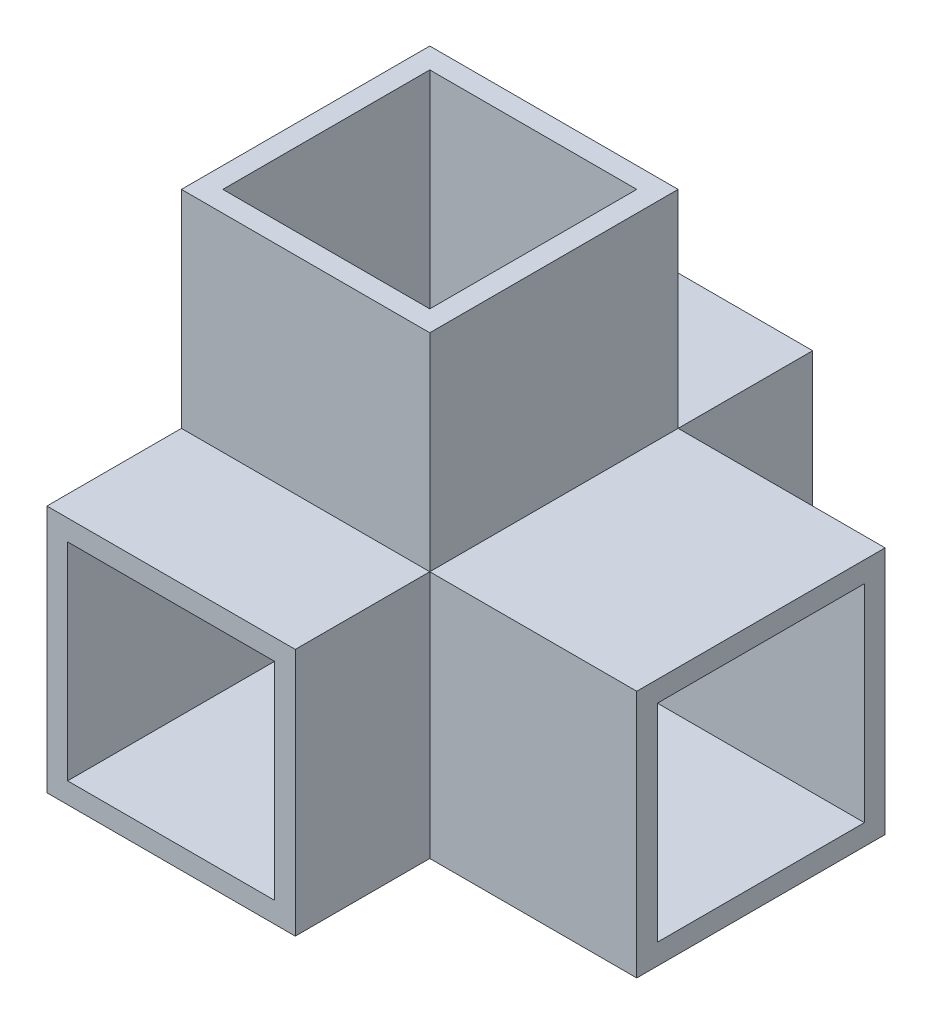
ISO-10303-21;
HEADER;
FILE_DESCRIPTION(('STEP AP214'),'2;1');
FILE_NAME('part.step','',(''),(''),'','','');
FILE_SCHEMA(('AUTOMOTIVE_DESIGN { 1 0 10303 214 1 1 1 1 }'));
ENDSEC;
DATA;
#1=APPLICATION_CONTEXT('core data for automotive mechanical design processes');
#2=APPLICATION_PROTOCOL_DEFINITION('international standard','automotive_design',2000,#1);
#3=PRODUCT_CONTEXT('',#1,'mechanical');
#4=PRODUCT('Part','Part','',(#3));
#5=PRODUCT_RELATED_PRODUCT_CATEGORY('part','',(#4));
#6=PRODUCT_DEFINITION_FORMATION('','',#4);
#7=PRODUCT_DEFINITION_CONTEXT('part definition',#1,'design');
#8=PRODUCT_DEFINITION('design','',#6,#7);
#9=PRODUCT_DEFINITION_SHAPE('','',#8);
#10=(LENGTH_UNIT() NAMED_UNIT(*) SI_UNIT(.MILLI.,.METRE.));
#11=(NAMED_UNIT(*) PLANE_ANGLE_UNIT() SI_UNIT($,.RADIAN.));
#12=(NAMED_UNIT(*) SI_UNIT($,.STERADIAN.) SOLID_ANGLE_UNIT());
#13=UNCERTAINTY_MEASURE_WITH_UNIT(LENGTH_MEASURE(1.E-05),#10,'distance_accuracy_value','');
#14=(GEOMETRIC_REPRESENTATION_CONTEXT(3) GLOBAL_UNCERTAINTY_ASSIGNED_CONTEXT((#13)) GLOBAL_UNIT_ASSIGNED_CONTEXT((#10,
#11,#12)) REPRESENTATION_CONTEXT('',''));
#15=CARTESIAN_POINT('',(0.,0.,0.));
#16=DIRECTION('',(0.,0.,1.));
#17=DIRECTION('',(1.,0.,0.));
#18=AXIS2_PLACEMENT_3D('',#15,#16,#17);
#19=CARTESIAN_POINT('',(-24.,24.,100.));
#20=DIRECTION('',(0.,-1.,0.));
#21=DIRECTION('',(1.,0.,0.));
#22=AXIS2_PLACEMENT_3D('',#19,#20,#21);
#23=PLANE('',#22);
#24=DIRECTION('',(1.,0.,0.));
#25=VECTOR('',#24,1.);
#26=CARTESIAN_POINT('',(24.,24.,74.));
#27=LINE('',#26,#25);
#28=CARTESIAN_POINT('',(-24.,24.,74.));
#29=VERTEX_POINT('',#28);
#30=CARTESIAN_POINT('',(24.,24.,74.));
#31=VERTEX_POINT('',#30);
#32=EDGE_CURVE('E60',#29,#31,#27,.T.);
#33=ORIENTED_EDGE('',*,*,#32,.F.);
#34=DIRECTION('',(0.,0.,-1.));
#35=VECTOR('',#34,1.);
#36=CARTESIAN_POINT('',(-24.,24.,100.));
#37=LINE('',#36,#35);
#38=CARTESIAN_POINT('',(-24.,24.,100.));
#39=VERTEX_POINT('',#38);
#40=EDGE_CURVE('E372',#39,#29,#37,.T.);
#41=ORIENTED_EDGE('',*,*,#40,.F.);
#42=DIRECTION('',(-1.,0.,0.));
#43=VECTOR('',#42,1.);
#44=CARTESIAN_POINT('',(-24.,24.,100.));
#45=LINE('',#44,#43);
#46=CARTESIAN_POINT('',(24.,24.,100.));
#47=VERTEX_POINT('',#46);
#48=EDGE_CURVE('E359',#47,#39,#45,.T.);
#49=ORIENTED_EDGE('',*,*,#48,.F.);
#50=DIRECTION('',(0.,0.,-1.));
#51=VECTOR('',#50,1.);
#52=CARTESIAN_POINT('',(24.,24.,100.));
#53=LINE('',#52,#51);
#54=EDGE_CURVE('E375',#47,#31,#53,.T.);
#55=ORIENTED_EDGE('',*,*,#54,.T.);
#56=EDGE_LOOP('',(#33,#41,#49,#55));
#57=FACE_BOUND('',#56,.T.);
#58=ADVANCED_FACE('F37',(#57),#23,.F.);
#59=DIRECTION('',(0.,0.,-1.));
#60=VECTOR('',#59,1.);
#61=CARTESIAN_POINT('',(24.,24.,26.));
#62=LINE('',#61,#60);
#63=CARTESIAN_POINT('',(24.,24.,26.));
#64=VERTEX_POINT('',#63);
#65=EDGE_CURVE('E212',#31,#64,#62,.T.);
#66=ORIENTED_EDGE('',*,*,#65,.F.);
#67=DIRECTION('',(-1.,0.,0.));
#68=VECTOR('',#67,1.);
#69=CARTESIAN_POINT('',(64.,24.,74.));
#70=LINE('',#69,#68);
#71=CARTESIAN_POINT('',(64.,24.,74.));
#72=VERTEX_POINT('',#71);
#73=EDGE_CURVE('E303',#72,#31,#70,.T.);
#74=ORIENTED_EDGE('',*,*,#73,.F.);
#75=DIRECTION('',(0.,0.,1.));
#76=VECTOR('',#75,1.);
#77=CARTESIAN_POINT('',(64.,24.,74.));
#78=LINE('',#77,#76);
#79=CARTESIAN_POINT('',(64.,24.,26.));
#80=VERTEX_POINT('',#79);
#81=EDGE_CURVE('E301',#80,#72,#78,.T.);
#82=ORIENTED_EDGE('',*,*,#81,.F.);
#83=DIRECTION('',(-1.,0.,0.));
#84=VECTOR('',#83,1.);
#85=CARTESIAN_POINT('',(64.,24.,26.));
#86=LINE('',#85,#84);
#87=EDGE_CURVE('E310',#80,#64,#86,.T.);
#88=ORIENTED_EDGE('',*,*,#87,.T.);
#89=EDGE_LOOP('',(#66,#74,#82,#88));
#90=FACE_BOUND('',#89,.T.);
#91=ADVANCED_FACE('F403',(#90),#23,.F.);
#92=DIRECTION('',(-1.,0.,0.));
#93=VECTOR('',#92,1.);
#94=CARTESIAN_POINT('',(24.,24.,26.));
#95=LINE('',#94,#93);
#96=CARTESIAN_POINT('',(-24.,24.,26.));
#97=VERTEX_POINT('',#96);
#98=EDGE_CURVE('E247',#64,#97,#95,.T.);
#99=ORIENTED_EDGE('',*,*,#98,.F.);
#100=CARTESIAN_POINT('',(24.,24.,0.));
#101=VERTEX_POINT('',#100);
#102=EDGE_CURVE('E374',#64,#101,#53,.T.);
#103=ORIENTED_EDGE('',*,*,#102,.T.);
#104=DIRECTION('',(-1.,0.,0.));
#105=VECTOR('',#104,1.);
#106=CARTESIAN_POINT('',(-24.,24.,0.));
#107=LINE('',#106,#105);
#108=CARTESIAN_POINT('',(-24.,24.,0.));
#109=VERTEX_POINT('',#108);
#110=EDGE_CURVE('E355',#101,#109,#107,.T.);
#111=ORIENTED_EDGE('',*,*,#110,.T.);
#112=EDGE_CURVE('E361',#97,#109,#37,.T.);
#113=ORIENTED_EDGE('',*,*,#112,.F.);
#114=EDGE_LOOP('',(#99,#103,#111,#113));
#115=FACE_BOUND('',#114,.T.);
#116=ADVANCED_FACE('F396',(#115),#23,.F.);
#117=CARTESIAN_POINT('',(24.,24.,100.));
#118=DIRECTION('',(-1.,0.,0.));
#119=DIRECTION('',(0.,-1.,0.));
#120=AXIS2_PLACEMENT_3D('',#117,#118,#119);
#121=PLANE('',#120);
#122=DIRECTION('',(0.,-1.,0.));
#123=VECTOR('',#122,1.);
#124=CARTESIAN_POINT('',(24.,24.,74.));
#125=LINE('',#124,#123);
#126=CARTESIAN_POINT('',(24.,-24.,74.));
#127=VERTEX_POINT('',#126);
#128=EDGE_CURVE('E292',#31,#127,#125,.T.);
#129=ORIENTED_EDGE('',*,*,#128,.F.);
#130=ORIENTED_EDGE('',*,*,#54,.F.);
#131=DIRECTION('',(0.,1.,0.));
#132=VECTOR('',#131,1.);
#133=CARTESIAN_POINT('',(24.,24.,100.));
#134=LINE('',#133,#132);
#135=CARTESIAN_POINT('',(24.,-24.,100.));
#136=VERTEX_POINT('',#135);
#137=EDGE_CURVE('E357',#136,#47,#134,.T.);
#138=ORIENTED_EDGE('',*,*,#137,.F.);
#139=DIRECTION('',(0.,0.,-1.));
#140=VECTOR('',#139,1.);
#141=CARTESIAN_POINT('',(24.,-24.,100.));
#142=LINE('',#141,#140);
#143=EDGE_CURVE('E45',#136,#127,#142,.T.);
#144=ORIENTED_EDGE('',*,*,#143,.T.);
#145=EDGE_LOOP('',(#129,#130,#138,#144));
#146=FACE_BOUND('',#145,.T.);
#147=ADVANCED_FACE('F425',(#146),#121,.F.);
#148=DIRECTION('',(0.,1.,0.));
#149=VECTOR('',#148,1.);
#150=CARTESIAN_POINT('',(24.,24.,26.));
#151=LINE('',#150,#149);
#152=CARTESIAN_POINT('',(24.,-24.,26.));
#153=VERTEX_POINT('',#152);
#154=EDGE_CURVE('E297',#153,#64,#151,.T.);
#155=ORIENTED_EDGE('',*,*,#154,.F.);
#156=CARTESIAN_POINT('',(24.,-24.,0.));
#157=VERTEX_POINT('',#156);
#158=EDGE_CURVE('E376',#153,#157,#142,.T.);
#159=ORIENTED_EDGE('',*,*,#158,.T.);
#160=DIRECTION('',(0.,1.,0.));
#161=VECTOR('',#160,1.);
#162=CARTESIAN_POINT('',(24.,24.,0.));
#163=LINE('',#162,#161);
#164=EDGE_CURVE('E367',#157,#101,#163,.T.);
#165=ORIENTED_EDGE('',*,*,#164,.T.);
#166=ORIENTED_EDGE('',*,*,#102,.F.);
#167=EDGE_LOOP('',(#155,#159,#165,#166));
#168=FACE_BOUND('',#167,.T.);
#169=ADVANCED_FACE('F383',(#168),#121,.F.);
#170=CARTESIAN_POINT('',(0.,0.,100.));
#171=DIRECTION('',(0.,0.,1.));
#172=DIRECTION('',(1.,0.,0.));
#173=AXIS2_PLACEMENT_3D('',#170,#171,#172);
#174=PLANE('',#173);
#175=DIRECTION('',(0.,-1.,0.));
#176=VECTOR('',#175,1.);
#177=CARTESIAN_POINT('',(-24.,24.,100.));
#178=LINE('',#177,#176);
#179=CARTESIAN_POINT('',(-24.,-24.,100.));
#180=VERTEX_POINT('',#179);
#181=EDGE_CURVE('E351',#39,#180,#178,.T.);
#182=ORIENTED_EDGE('',*,*,#181,.T.);
#183=DIRECTION('',(1.,0.,0.));
#184=VECTOR('',#183,1.);
#185=CARTESIAN_POINT('',(-24.,-24.,100.));
#186=LINE('',#185,#184);
#187=EDGE_CURVE('E354',#180,#136,#186,.T.);
#188=ORIENTED_EDGE('',*,*,#187,.T.);
#189=ORIENTED_EDGE('',*,*,#137,.T.);
#190=ORIENTED_EDGE('',*,*,#48,.T.);
#191=EDGE_LOOP('',(#182,#188,#189,#190));
#192=FACE_BOUND('',#191,.T.);
#193=DIRECTION('',(1.,0.,0.));
#194=VECTOR('',#193,1.);
#195=CARTESIAN_POINT('',(-20.,-20.,100.));
#196=LINE('',#195,#194);
#197=CARTESIAN_POINT('',(-20.,-20.,100.));
#198=VERTEX_POINT('',#197);
#199=CARTESIAN_POINT('',(20.,-20.,100.));
#200=VERTEX_POINT('',#199);
#201=EDGE_CURVE('E322',#198,#200,#196,.T.);
#202=ORIENTED_EDGE('',*,*,#201,.F.);
#203=DIRECTION('',(0.,-1.,0.));
#204=VECTOR('',#203,1.);
#205=CARTESIAN_POINT('',(-20.,20.,100.));
#206=LINE('',#205,#204);
#207=CARTESIAN_POINT('',(-20.,20.,100.));
#208=VERTEX_POINT('',#207);
#209=EDGE_CURVE('E320',#208,#198,#206,.T.);
#210=ORIENTED_EDGE('',*,*,#209,.F.);
#211=DIRECTION('',(-1.,0.,0.));
#212=VECTOR('',#211,1.);
#213=CARTESIAN_POINT('',(-20.,20.,100.));
#214=LINE('',#213,#212);
#215=CARTESIAN_POINT('',(20.,20.,100.));
#216=VERTEX_POINT('',#215);
#217=EDGE_CURVE('E328',#216,#208,#214,.T.);
#218=ORIENTED_EDGE('',*,*,#217,.F.);
#219=DIRECTION('',(0.,1.,0.));
#220=VECTOR('',#219,1.);
#221=CARTESIAN_POINT('',(20.,20.,100.));
#222=LINE('',#221,#220);
#223=EDGE_CURVE('E325',#200,#216,#222,.T.);
#224=ORIENTED_EDGE('',*,*,#223,.F.);
#225=EDGE_LOOP('',(#202,#210,#218,#224));
#226=FACE_BOUND('',#225,.T.);
#227=ADVANCED_FACE('F423',(#192,#226),#174,.T.);
#228=CARTESIAN_POINT('',(0.,0.,0.));
#229=DIRECTION('',(0.,0.,1.));
#230=DIRECTION('',(1.,0.,0.));
#231=AXIS2_PLACEMENT_3D('',#228,#229,#230);
#232=PLANE('',#231);
#233=DIRECTION('',(0.,-1.,0.));
#234=VECTOR('',#233,1.);
#235=CARTESIAN_POINT('',(-24.,24.,0.));
#236=LINE('',#235,#234);
#237=CARTESIAN_POINT('',(-24.,-24.,0.));
#238=VERTEX_POINT('',#237);
#239=EDGE_CURVE('E350',#109,#238,#236,.T.);
#240=ORIENTED_EDGE('',*,*,#239,.F.);
#241=ORIENTED_EDGE('',*,*,#110,.F.);
#242=ORIENTED_EDGE('',*,*,#164,.F.);
#243=DIRECTION('',(1.,0.,0.));
#244=VECTOR('',#243,1.);
#245=CARTESIAN_POINT('',(-24.,-24.,0.));
#246=LINE('',#245,#244);
#247=EDGE_CURVE('E364',#238,#157,#246,.T.);
#248=ORIENTED_EDGE('',*,*,#247,.F.);
#249=EDGE_LOOP('',(#240,#241,#242,#248));
#250=FACE_BOUND('',#249,.T.);
#251=DIRECTION('',(0.,-1.,0.));
#252=VECTOR('',#251,1.);
#253=CARTESIAN_POINT('',(-20.,20.,0.));
#254=LINE('',#253,#252);
#255=CARTESIAN_POINT('',(-20.,20.,0.));
#256=VERTEX_POINT('',#255);
#257=CARTESIAN_POINT('',(-20.,-20.,0.));
#258=VERTEX_POINT('',#257);
#259=EDGE_CURVE('E319',#256,#258,#254,.T.);
#260=ORIENTED_EDGE('',*,*,#259,.T.);
#261=DIRECTION('',(1.,0.,0.));
#262=VECTOR('',#261,1.);
#263=CARTESIAN_POINT('',(-20.,-20.,0.));
#264=LINE('',#263,#262);
#265=CARTESIAN_POINT('',(20.,-20.,0.));
#266=VERTEX_POINT('',#265);
#267=EDGE_CURVE('E333',#258,#266,#264,.T.);
#268=ORIENTED_EDGE('',*,*,#267,.T.);
#269=DIRECTION('',(0.,1.,0.));
#270=VECTOR('',#269,1.);
#271=CARTESIAN_POINT('',(20.,20.,0.));
#272=LINE('',#271,#270);
#273=CARTESIAN_POINT('',(20.,20.,0.));
#274=VERTEX_POINT('',#273);
#275=EDGE_CURVE('E336',#266,#274,#272,.T.);
#276=ORIENTED_EDGE('',*,*,#275,.T.);
#277=DIRECTION('',(-1.,0.,0.));
#278=VECTOR('',#277,1.);
#279=CARTESIAN_POINT('',(-20.,20.,0.));
#280=LINE('',#279,#278);
#281=EDGE_CURVE('E323',#274,#256,#280,.T.);
#282=ORIENTED_EDGE('',*,*,#281,.T.);
#283=EDGE_LOOP('',(#260,#268,#276,#282));
#284=FACE_BOUND('',#283,.T.);
#285=ADVANCED_FACE('F393',(#250,#284),#232,.F.);
#286=CARTESIAN_POINT('',(-24.,24.,100.));
#287=DIRECTION('',(1.,0.,0.));
#288=DIRECTION('',(0.,1.,0.));
#289=AXIS2_PLACEMENT_3D('',#286,#287,#288);
#290=PLANE('',#289);
#291=ORIENTED_EDGE('',*,*,#239,.T.);
#292=DIRECTION('',(0.,0.,-1.));
#293=VECTOR('',#292,1.);
#294=CARTESIAN_POINT('',(-24.,-24.,100.));
#295=LINE('',#294,#293);
#296=EDGE_CURVE('E11',#180,#238,#295,.T.);
#297=ORIENTED_EDGE('',*,*,#296,.F.);
#298=ORIENTED_EDGE('',*,*,#181,.F.);
#299=ORIENTED_EDGE('',*,*,#40,.T.);
#300=DIRECTION('',(0.,-1.,0.));
#301=VECTOR('',#300,1.);
#302=CARTESIAN_POINT('',(-24.,64.,74.));
#303=LINE('',#302,#301);
#304=CARTESIAN_POINT('',(-24.,64.,74.));
#305=VERTEX_POINT('',#304);
#306=EDGE_CURVE('E253',#305,#29,#303,.T.);
#307=ORIENTED_EDGE('',*,*,#306,.F.);
#308=DIRECTION('',(0.,0.,1.));
#309=VECTOR('',#308,1.);
#310=CARTESIAN_POINT('',(-24.,64.,26.));
#311=LINE('',#310,#309);
#312=CARTESIAN_POINT('',(-24.,64.,26.));
#313=VERTEX_POINT('',#312);
#314=EDGE_CURVE('E240',#313,#305,#311,.T.);
#315=ORIENTED_EDGE('',*,*,#314,.F.);
#316=DIRECTION('',(0.,-1.,0.));
#317=VECTOR('',#316,1.);
#318=CARTESIAN_POINT('',(-24.,64.,26.));
#319=LINE('',#318,#317);
#320=EDGE_CURVE('E256',#313,#97,#319,.T.);
#321=ORIENTED_EDGE('',*,*,#320,.T.);
#322=ORIENTED_EDGE('',*,*,#112,.T.);
#323=EDGE_LOOP('',(#291,#297,#298,#299,#307,#315,#321,#322));
#324=FACE_BOUND('',#323,.T.);
#325=ADVANCED_FACE('F39',(#324),#290,.F.);
#326=CARTESIAN_POINT('',(-24.,-24.,100.));
#327=DIRECTION('',(0.,1.,0.));
#328=DIRECTION('',(-1.,0.,0.));
#329=AXIS2_PLACEMENT_3D('',#326,#327,#328);
#330=PLANE('',#329);
#331=ORIENTED_EDGE('',*,*,#247,.T.);
#332=ORIENTED_EDGE('',*,*,#158,.F.);
#333=DIRECTION('',(-1.,0.,0.));
#334=VECTOR('',#333,1.);
#335=CARTESIAN_POINT('',(64.,-24.,26.));
#336=LINE('',#335,#334);
#337=CARTESIAN_POINT('',(64.,-24.,26.));
#338=VERTEX_POINT('',#337);
#339=EDGE_CURVE('E313',#338,#153,#336,.T.);
#340=ORIENTED_EDGE('',*,*,#339,.F.);
#341=DIRECTION('',(0.,0.,-1.));
#342=VECTOR('',#341,1.);
#343=CARTESIAN_POINT('',(64.,-24.,74.));
#344=LINE('',#343,#342);
#345=CARTESIAN_POINT('',(64.,-24.,74.));
#346=VERTEX_POINT('',#345);
#347=EDGE_CURVE('E296',#346,#338,#344,.T.);
#348=ORIENTED_EDGE('',*,*,#347,.F.);
#349=DIRECTION('',(-1.,0.,0.));
#350=VECTOR('',#349,1.);
#351=CARTESIAN_POINT('',(64.,-24.,74.));
#352=LINE('',#351,#350);
#353=EDGE_CURVE('E316',#346,#127,#352,.T.);
#354=ORIENTED_EDGE('',*,*,#353,.T.);
#355=ORIENTED_EDGE('',*,*,#143,.F.);
#356=ORIENTED_EDGE('',*,*,#187,.F.);
#357=ORIENTED_EDGE('',*,*,#296,.T.);
#358=EDGE_LOOP('',(#331,#332,#340,#348,#354,#355,#356,#357));
#359=FACE_BOUND('',#358,.T.);
#360=ADVANCED_FACE('F389',(#359),#330,.F.);
#361=CARTESIAN_POINT('',(-20.,20.,100.));
#362=DIRECTION('',(1.,0.,0.));
#363=DIRECTION('',(0.,1.,0.));
#364=AXIS2_PLACEMENT_3D('',#361,#362,#363);
#365=PLANE('',#364);
#366=ORIENTED_EDGE('',*,*,#259,.F.);
#367=DIRECTION('',(0.,0.,-1.));
#368=VECTOR('',#367,1.);
#369=CARTESIAN_POINT('',(-20.,20.,100.));
#370=LINE('',#369,#368);
#371=EDGE_CURVE('E330',#208,#256,#370,.T.);
#372=ORIENTED_EDGE('',*,*,#371,.F.);
#373=ORIENTED_EDGE('',*,*,#209,.T.);
#374=DIRECTION('',(0.,0.,-1.));
#375=VECTOR('',#374,1.);
#376=CARTESIAN_POINT('',(-20.,-20.,100.));
#377=LINE('',#376,#375);
#378=EDGE_CURVE('E347',#198,#258,#377,.T.);
#379=ORIENTED_EDGE('',*,*,#378,.T.);
#380=EDGE_LOOP('',(#366,#372,#373,#379));
#381=FACE_BOUND('',#380,.T.);
#382=ADVANCED_FACE('F488',(#381),#365,.T.);
#383=CARTESIAN_POINT('',(-20.,-20.,100.));
#384=DIRECTION('',(0.,1.,0.));
#385=DIRECTION('',(-1.,0.,0.));
#386=AXIS2_PLACEMENT_3D('',#383,#384,#385);
#387=PLANE('',#386);
#388=ORIENTED_EDGE('',*,*,#267,.F.);
#389=ORIENTED_EDGE('',*,*,#378,.F.);
#390=ORIENTED_EDGE('',*,*,#201,.T.);
#391=DIRECTION('',(0.,0.,-1.));
#392=VECTOR('',#391,1.);
#393=CARTESIAN_POINT('',(20.,-20.,100.));
#394=LINE('',#393,#392);
#395=EDGE_CURVE('E345',#200,#266,#394,.T.);
#396=ORIENTED_EDGE('',*,*,#395,.T.);
#397=EDGE_LOOP('',(#388,#389,#390,#396));
#398=FACE_BOUND('',#397,.T.);
#399=ADVANCED_FACE('F493',(#398),#387,.T.);
#400=CARTESIAN_POINT('',(20.,20.,100.));
#401=DIRECTION('',(-1.,0.,0.));
#402=DIRECTION('',(0.,-1.,0.));
#403=AXIS2_PLACEMENT_3D('',#400,#401,#402);
#404=PLANE('',#403);
#405=ORIENTED_EDGE('',*,*,#275,.F.);
#406=ORIENTED_EDGE('',*,*,#395,.F.);
#407=ORIENTED_EDGE('',*,*,#223,.T.);
#408=DIRECTION('',(0.,0.,-1.));
#409=VECTOR('',#408,1.);
#410=CARTESIAN_POINT('',(20.,20.,100.));
#411=LINE('',#410,#409);
#412=EDGE_CURVE('E343',#216,#274,#411,.T.);
#413=ORIENTED_EDGE('',*,*,#412,.T.);
#414=EDGE_LOOP('',(#405,#406,#407,#413));
#415=FACE_BOUND('',#414,.T.);
#416=ADVANCED_FACE('F506',(#415),#404,.T.);
#417=CARTESIAN_POINT('',(-20.,20.,100.));
#418=DIRECTION('',(0.,-1.,0.));
#419=DIRECTION('',(1.,0.,0.));
#420=AXIS2_PLACEMENT_3D('',#417,#418,#419);
#421=PLANE('',#420);
#422=ORIENTED_EDGE('',*,*,#281,.F.);
#423=ORIENTED_EDGE('',*,*,#412,.F.);
#424=ORIENTED_EDGE('',*,*,#217,.T.);
#425=ORIENTED_EDGE('',*,*,#371,.T.);
#426=EDGE_LOOP('',(#422,#423,#424,#425));
#427=FACE_BOUND('',#426,.T.);
#428=ADVANCED_FACE('F434',(#427),#421,.T.);
#429=CARTESIAN_POINT('',(64.,0.,0.));
#430=DIRECTION('',(1.,0.,0.));
#431=DIRECTION('',(0.,1.,0.));
#432=AXIS2_PLACEMENT_3D('',#429,#430,#431);
#433=PLANE('',#432);
#434=DIRECTION('',(0.,-1.,0.));
#435=VECTOR('',#434,1.);
#436=CARTESIAN_POINT('',(64.,24.,74.));
#437=LINE('',#436,#435);
#438=EDGE_CURVE('E293',#72,#346,#437,.T.);
#439=ORIENTED_EDGE('',*,*,#438,.T.);
#440=ORIENTED_EDGE('',*,*,#347,.T.);
#441=DIRECTION('',(0.,1.,0.));
#442=VECTOR('',#441,1.);
#443=CARTESIAN_POINT('',(64.,24.,26.));
#444=LINE('',#443,#442);
#445=EDGE_CURVE('E299',#338,#80,#444,.T.);
#446=ORIENTED_EDGE('',*,*,#445,.T.);
#447=ORIENTED_EDGE('',*,*,#81,.T.);
#448=EDGE_LOOP('',(#439,#440,#446,#447));
#449=FACE_BOUND('',#448,.T.);
#450=DIRECTION('',(0.,0.,-1.));
#451=VECTOR('',#450,1.);
#452=CARTESIAN_POINT('',(64.,-20.,70.));
#453=LINE('',#452,#451);
#454=CARTESIAN_POINT('',(64.,-20.,70.));
#455=VERTEX_POINT('',#454);
#456=CARTESIAN_POINT('',(64.,-20.,30.));
#457=VERTEX_POINT('',#456);
#458=EDGE_CURVE('E265',#455,#457,#453,.T.);
#459=ORIENTED_EDGE('',*,*,#458,.F.);
#460=DIRECTION('',(0.,-1.,0.));
#461=VECTOR('',#460,1.);
#462=CARTESIAN_POINT('',(64.,20.,70.));
#463=LINE('',#462,#461);
#464=CARTESIAN_POINT('',(64.,20.,70.));
#465=VERTEX_POINT('',#464);
#466=EDGE_CURVE('E263',#465,#455,#463,.T.);
#467=ORIENTED_EDGE('',*,*,#466,.F.);
#468=DIRECTION('',(0.,0.,1.));
#469=VECTOR('',#468,1.);
#470=CARTESIAN_POINT('',(64.,20.,70.));
#471=LINE('',#470,#469);
#472=CARTESIAN_POINT('',(64.,20.,30.));
#473=VERTEX_POINT('',#472);
#474=EDGE_CURVE('E271',#473,#465,#471,.T.);
#475=ORIENTED_EDGE('',*,*,#474,.F.);
#476=DIRECTION('',(0.,1.,0.));
#477=VECTOR('',#476,1.);
#478=CARTESIAN_POINT('',(64.,20.,30.));
#479=LINE('',#478,#477);
#480=EDGE_CURVE('E268',#457,#473,#479,.T.);
#481=ORIENTED_EDGE('',*,*,#480,.F.);
#482=EDGE_LOOP('',(#459,#467,#475,#481));
#483=FACE_BOUND('',#482,.T.);
#484=ADVANCED_FACE('F431',(#449,#483),#433,.T.);
#485=CARTESIAN_POINT('',(64.,24.,74.));
#486=DIRECTION('',(0.,0.,-1.));
#487=DIRECTION('',(-1.,0.,0.));
#488=AXIS2_PLACEMENT_3D('',#485,#486,#487);
#489=PLANE('',#488);
#490=ORIENTED_EDGE('',*,*,#128,.T.);
#491=ORIENTED_EDGE('',*,*,#353,.F.);
#492=ORIENTED_EDGE('',*,*,#438,.F.);
#493=ORIENTED_EDGE('',*,*,#73,.T.);
#494=EDGE_LOOP('',(#490,#491,#492,#493));
#495=FACE_BOUND('',#494,.T.);
#496=ADVANCED_FACE('F428',(#495),#489,.F.);
#497=CARTESIAN_POINT('',(64.,24.,26.));
#498=DIRECTION('',(0.,0.,1.));
#499=DIRECTION('',(1.,0.,0.));
#500=AXIS2_PLACEMENT_3D('',#497,#498,#499);
#501=PLANE('',#500);
#502=ORIENTED_EDGE('',*,*,#154,.T.);
#503=ORIENTED_EDGE('',*,*,#87,.F.);
#504=ORIENTED_EDGE('',*,*,#445,.F.);
#505=ORIENTED_EDGE('',*,*,#339,.T.);
#506=EDGE_LOOP('',(#502,#503,#504,#505));
#507=FACE_BOUND('',#506,.T.);
#508=ADVANCED_FACE('F399',(#507),#501,.F.);
#509=CARTESIAN_POINT('',(64.,20.,70.));
#510=DIRECTION('',(0.,0.,-1.));
#511=DIRECTION('',(-1.,0.,0.));
#512=AXIS2_PLACEMENT_3D('',#509,#510,#511);
#513=PLANE('',#512);
#514=DIRECTION('',(0.,-1.,0.));
#515=VECTOR('',#514,1.);
#516=CARTESIAN_POINT('',(24.,20.,70.));
#517=LINE('',#516,#515);
#518=CARTESIAN_POINT('',(24.,20.,70.));
#519=VERTEX_POINT('',#518);
#520=CARTESIAN_POINT('',(24.,-20.,70.));
#521=VERTEX_POINT('',#520);
#522=EDGE_CURVE('E262',#519,#521,#517,.T.);
#523=ORIENTED_EDGE('',*,*,#522,.F.);
#524=DIRECTION('',(-1.,0.,0.));
#525=VECTOR('',#524,1.);
#526=CARTESIAN_POINT('',(64.,20.,70.));
#527=LINE('',#526,#525);
#528=EDGE_CURVE('E273',#465,#519,#527,.T.);
#529=ORIENTED_EDGE('',*,*,#528,.F.);
#530=ORIENTED_EDGE('',*,*,#466,.T.);
#531=DIRECTION('',(-1.,0.,0.));
#532=VECTOR('',#531,1.);
#533=CARTESIAN_POINT('',(64.,-20.,70.));
#534=LINE('',#533,#532);
#535=EDGE_CURVE('E289',#455,#521,#534,.T.);
#536=ORIENTED_EDGE('',*,*,#535,.T.);
#537=EDGE_LOOP('',(#523,#529,#530,#536));
#538=FACE_BOUND('',#537,.T.);
#539=ADVANCED_FACE('F452',(#538),#513,.T.);
#540=CARTESIAN_POINT('',(64.,-20.,70.));
#541=DIRECTION('',(0.,1.,0.));
#542=DIRECTION('',(-1.,0.,0.));
#543=AXIS2_PLACEMENT_3D('',#540,#541,#542);
#544=PLANE('',#543);
#545=DIRECTION('',(0.,0.,-1.));
#546=VECTOR('',#545,1.);
#547=CARTESIAN_POINT('',(24.,-20.,70.));
#548=LINE('',#547,#546);
#549=CARTESIAN_POINT('',(24.,-20.,30.));
#550=VERTEX_POINT('',#549);
#551=EDGE_CURVE('E276',#521,#550,#548,.T.);
#552=ORIENTED_EDGE('',*,*,#551,.F.);
#553=ORIENTED_EDGE('',*,*,#535,.F.);
#554=ORIENTED_EDGE('',*,*,#458,.T.);
#555=DIRECTION('',(-1.,0.,0.));
#556=VECTOR('',#555,1.);
#557=CARTESIAN_POINT('',(64.,-20.,30.));
#558=LINE('',#557,#556);
#559=EDGE_CURVE('E287',#457,#550,#558,.T.);
#560=ORIENTED_EDGE('',*,*,#559,.T.);
#561=EDGE_LOOP('',(#552,#553,#554,#560));
#562=FACE_BOUND('',#561,.T.);
#563=ADVANCED_FACE('F443',(#562),#544,.T.);
#564=CARTESIAN_POINT('',(64.,20.,30.));
#565=DIRECTION('',(0.,0.,1.));
#566=DIRECTION('',(0.,-1.,0.));
#567=AXIS2_PLACEMENT_3D('',#564,#565,#566);
#568=PLANE('',#567);
#569=DIRECTION('',(0.,1.,0.));
#570=VECTOR('',#569,1.);
#571=CARTESIAN_POINT('',(24.,20.,30.));
#572=LINE('',#571,#570);
#573=CARTESIAN_POINT('',(24.,20.,30.));
#574=VERTEX_POINT('',#573);
#575=EDGE_CURVE('E279',#550,#574,#572,.T.);
#576=ORIENTED_EDGE('',*,*,#575,.F.);
#577=ORIENTED_EDGE('',*,*,#559,.F.);
#578=ORIENTED_EDGE('',*,*,#480,.T.);
#579=DIRECTION('',(-1.,0.,0.));
#580=VECTOR('',#579,1.);
#581=CARTESIAN_POINT('',(64.,20.,30.));
#582=LINE('',#581,#580);
#583=EDGE_CURVE('E285',#473,#574,#582,.T.);
#584=ORIENTED_EDGE('',*,*,#583,.T.);
#585=EDGE_LOOP('',(#576,#577,#578,#584));
#586=FACE_BOUND('',#585,.T.);
#587=ADVANCED_FACE('F446',(#586),#568,.T.);
#588=CARTESIAN_POINT('',(64.,20.,70.));
#589=DIRECTION('',(0.,-1.,0.));
#590=DIRECTION('',(1.,0.,0.));
#591=AXIS2_PLACEMENT_3D('',#588,#589,#590);
#592=PLANE('',#591);
#593=DIRECTION('',(0.,0.,1.));
#594=VECTOR('',#593,1.);
#595=CARTESIAN_POINT('',(24.,20.,70.));
#596=LINE('',#595,#594);
#597=EDGE_CURVE('E266',#574,#519,#596,.T.);
#598=ORIENTED_EDGE('',*,*,#597,.F.);
#599=ORIENTED_EDGE('',*,*,#583,.F.);
#600=ORIENTED_EDGE('',*,*,#474,.T.);
#601=ORIENTED_EDGE('',*,*,#528,.T.);
#602=EDGE_LOOP('',(#598,#599,#600,#601));
#603=FACE_BOUND('',#602,.T.);
#604=ADVANCED_FACE('F455',(#603),#592,.T.);
#605=ORIENTED_EDGE('',*,*,#597,.T.);
#606=ORIENTED_EDGE('',*,*,#522,.T.);
#607=ORIENTED_EDGE('',*,*,#551,.T.);
#608=ORIENTED_EDGE('',*,*,#575,.T.);
#609=EDGE_LOOP('',(#605,#606,#607,#608));
#610=FACE_BOUND('',#609,.T.);
#611=ADVANCED_FACE('F449',(#610),#121,.F.);
#612=CARTESIAN_POINT('',(0.,64.,0.));
#613=DIRECTION('',(0.,-1.,0.));
#614=DIRECTION('',(1.,0.,0.));
#615=AXIS2_PLACEMENT_3D('',#612,#613,#614);
#616=PLANE('',#615);
#617=DIRECTION('',(0.,0.,-1.));
#618=VECTOR('',#617,1.);
#619=CARTESIAN_POINT('',(24.,64.,26.));
#620=LINE('',#619,#618);
#621=CARTESIAN_POINT('',(24.,64.,74.));
#622=VERTEX_POINT('',#621);
#623=CARTESIAN_POINT('',(24.,64.,26.));
#624=VERTEX_POINT('',#623);
#625=EDGE_CURVE('E235',#622,#624,#620,.T.);
#626=ORIENTED_EDGE('',*,*,#625,.T.);
#627=DIRECTION('',(-1.,0.,0.));
#628=VECTOR('',#627,1.);
#629=CARTESIAN_POINT('',(24.,64.,26.));
#630=LINE('',#629,#628);
#631=EDGE_CURVE('E238',#624,#313,#630,.T.);
#632=ORIENTED_EDGE('',*,*,#631,.T.);
#633=ORIENTED_EDGE('',*,*,#314,.T.);
#634=DIRECTION('',(1.,0.,0.));
#635=VECTOR('',#634,1.);
#636=CARTESIAN_POINT('',(24.,64.,74.));
#637=LINE('',#636,#635);
#638=EDGE_CURVE('E242',#305,#622,#637,.T.);
#639=ORIENTED_EDGE('',*,*,#638,.T.);
#640=EDGE_LOOP('',(#626,#632,#633,#639));
#641=FACE_BOUND('',#640,.T.);
#642=DIRECTION('',(0.,0.,1.));
#643=VECTOR('',#642,1.);
#644=CARTESIAN_POINT('',(-20.,64.,30.));
#645=LINE('',#644,#643);
#646=CARTESIAN_POINT('',(-20.,64.,30.));
#647=VERTEX_POINT('',#646);
#648=CARTESIAN_POINT('',(-20.,64.,70.));
#649=VERTEX_POINT('',#648);
#650=EDGE_CURVE('E196',#647,#649,#645,.T.);
#651=ORIENTED_EDGE('',*,*,#650,.F.);
#652=DIRECTION('',(-1.,0.,0.));
#653=VECTOR('',#652,1.);
#654=CARTESIAN_POINT('',(-20.,64.,30.));
#655=LINE('',#654,#653);
#656=CARTESIAN_POINT('',(20.,64.,30.));
#657=VERTEX_POINT('',#656);
#658=EDGE_CURVE('E220',#657,#647,#655,.T.);
#659=ORIENTED_EDGE('',*,*,#658,.F.);
#660=DIRECTION('',(0.,0.,-1.));
#661=VECTOR('',#660,1.);
#662=CARTESIAN_POINT('',(20.,64.,30.));
#663=LINE('',#662,#661);
#664=CARTESIAN_POINT('',(20.,64.,70.));
#665=VERTEX_POINT('',#664);
#666=EDGE_CURVE('E218',#665,#657,#663,.T.);
#667=ORIENTED_EDGE('',*,*,#666,.F.);
#668=DIRECTION('',(1.,0.,0.));
#669=VECTOR('',#668,1.);
#670=CARTESIAN_POINT('',(-20.,64.,70.));
#671=LINE('',#670,#669);
#672=EDGE_CURVE('E205',#649,#665,#671,.T.);
#673=ORIENTED_EDGE('',*,*,#672,.F.);
#674=EDGE_LOOP('',(#651,#659,#667,#673));
#675=FACE_BOUND('',#674,.T.);
#676=ADVANCED_FACE('F216',(#641,#675),#616,.F.);
#677=CARTESIAN_POINT('',(24.,64.,26.));
#678=DIRECTION('',(-1.,0.,0.));
#679=DIRECTION('',(0.,-1.,0.));
#680=AXIS2_PLACEMENT_3D('',#677,#678,#679);
#681=PLANE('',#680);
#682=ORIENTED_EDGE('',*,*,#65,.T.);
#683=DIRECTION('',(0.,-1.,0.));
#684=VECTOR('',#683,1.);
#685=CARTESIAN_POINT('',(24.,64.,26.));
#686=LINE('',#685,#684);
#687=EDGE_CURVE('E259',#624,#64,#686,.T.);
#688=ORIENTED_EDGE('',*,*,#687,.F.);
#689=ORIENTED_EDGE('',*,*,#625,.F.);
#690=DIRECTION('',(0.,-1.,0.));
#691=VECTOR('',#690,1.);
#692=CARTESIAN_POINT('',(24.,64.,74.));
#693=LINE('',#692,#691);
#694=EDGE_CURVE('E244',#622,#31,#693,.T.);
#695=ORIENTED_EDGE('',*,*,#694,.T.);
#696=EDGE_LOOP('',(#682,#688,#689,#695));
#697=FACE_BOUND('',#696,.T.);
#698=ADVANCED_FACE('F411',(#697),#681,.F.);
#699=CARTESIAN_POINT('',(24.,64.,26.));
#700=DIRECTION('',(0.,0.,1.));
#701=DIRECTION('',(1.,0.,0.));
#702=AXIS2_PLACEMENT_3D('',#699,#700,#701);
#703=PLANE('',#702);
#704=ORIENTED_EDGE('',*,*,#98,.T.);
#705=ORIENTED_EDGE('',*,*,#320,.F.);
#706=ORIENTED_EDGE('',*,*,#631,.F.);
#707=ORIENTED_EDGE('',*,*,#687,.T.);
#708=EDGE_LOOP('',(#704,#705,#706,#707));
#709=FACE_BOUND('',#708,.T.);
#710=ADVANCED_FACE('F407',(#709),#703,.F.);
#711=CARTESIAN_POINT('',(24.,64.,74.));
#712=DIRECTION('',(0.,0.,-1.));
#713=DIRECTION('',(-1.,0.,0.));
#714=AXIS2_PLACEMENT_3D('',#711,#712,#713);
#715=PLANE('',#714);
#716=ORIENTED_EDGE('',*,*,#32,.T.);
#717=ORIENTED_EDGE('',*,*,#694,.F.);
#718=ORIENTED_EDGE('',*,*,#638,.F.);
#719=ORIENTED_EDGE('',*,*,#306,.T.);
#720=EDGE_LOOP('',(#716,#717,#718,#719));
#721=FACE_BOUND('',#720,.T.);
#722=ADVANCED_FACE('F415',(#721),#715,.F.);
#723=CARTESIAN_POINT('',(-20.,64.,30.));
#724=DIRECTION('',(1.,0.,0.));
#725=DIRECTION('',(0.,1.,0.));
#726=AXIS2_PLACEMENT_3D('',#723,#724,#725);
#727=PLANE('',#726);
#728=DIRECTION('',(0.,0.,1.));
#729=VECTOR('',#728,1.);
#730=CARTESIAN_POINT('',(-20.,24.,30.));
#731=LINE('',#730,#729);
#732=CARTESIAN_POINT('',(-20.,24.,30.));
#733=VERTEX_POINT('',#732);
#734=CARTESIAN_POINT('',(-20.,24.,70.));
#735=VERTEX_POINT('',#734);
#736=EDGE_CURVE('E224',#733,#735,#731,.T.);
#737=ORIENTED_EDGE('',*,*,#736,.F.);
#738=DIRECTION('',(0.,-1.,0.));
#739=VECTOR('',#738,1.);
#740=CARTESIAN_POINT('',(-20.,64.,30.));
#741=LINE('',#740,#739);
#742=EDGE_CURVE('E201',#647,#733,#741,.T.);
#743=ORIENTED_EDGE('',*,*,#742,.F.);
#744=ORIENTED_EDGE('',*,*,#650,.T.);
#745=DIRECTION('',(0.,-1.,0.));
#746=VECTOR('',#745,1.);
#747=CARTESIAN_POINT('',(-20.,64.,70.));
#748=LINE('',#747,#746);
#749=EDGE_CURVE('E199',#649,#735,#748,.T.);
#750=ORIENTED_EDGE('',*,*,#749,.T.);
#751=EDGE_LOOP('',(#737,#743,#744,#750));
#752=FACE_BOUND('',#751,.T.);
#753=ADVANCED_FACE('F198',(#752),#727,.T.);
#754=CARTESIAN_POINT('',(-20.,64.,70.));
#755=DIRECTION('',(0.,0.,-1.));
#756=DIRECTION('',(-1.,0.,0.));
#757=AXIS2_PLACEMENT_3D('',#754,#755,#756);
#758=PLANE('',#757);
#759=DIRECTION('',(1.,0.,0.));
#760=VECTOR('',#759,1.);
#761=CARTESIAN_POINT('',(-20.,24.,70.));
#762=LINE('',#761,#760);
#763=CARTESIAN_POINT('',(20.,24.,70.));
#764=VERTEX_POINT('',#763);
#765=EDGE_CURVE('E211',#735,#764,#762,.T.);
#766=ORIENTED_EDGE('',*,*,#765,.F.);
#767=ORIENTED_EDGE('',*,*,#749,.F.);
#768=ORIENTED_EDGE('',*,*,#672,.T.);
#769=DIRECTION('',(0.,-1.,0.));
#770=VECTOR('',#769,1.);
#771=CARTESIAN_POINT('',(20.,64.,70.));
#772=LINE('',#771,#770);
#773=EDGE_CURVE('E213',#665,#764,#772,.T.);
#774=ORIENTED_EDGE('',*,*,#773,.T.);
#775=EDGE_LOOP('',(#766,#767,#768,#774));
#776=FACE_BOUND('',#775,.T.);
#777=ADVANCED_FACE('F208',(#776),#758,.T.);
#778=CARTESIAN_POINT('',(20.,64.,30.));
#779=DIRECTION('',(-1.,0.,0.));
#780=DIRECTION('',(0.,-1.,0.));
#781=AXIS2_PLACEMENT_3D('',#778,#779,#780);
#782=PLANE('',#781);
#783=DIRECTION('',(0.,0.,-1.));
#784=VECTOR('',#783,1.);
#785=CARTESIAN_POINT('',(20.,24.,30.));
#786=LINE('',#785,#784);
#787=CARTESIAN_POINT('',(20.,24.,30.));
#788=VERTEX_POINT('',#787);
#789=EDGE_CURVE('E227',#764,#788,#786,.T.);
#790=ORIENTED_EDGE('',*,*,#789,.F.);
#791=ORIENTED_EDGE('',*,*,#773,.F.);
#792=ORIENTED_EDGE('',*,*,#666,.T.);
#793=DIRECTION('',(0.,-1.,0.));
#794=VECTOR('',#793,1.);
#795=CARTESIAN_POINT('',(20.,64.,30.));
#796=LINE('',#795,#794);
#797=EDGE_CURVE('E232',#657,#788,#796,.T.);
#798=ORIENTED_EDGE('',*,*,#797,.T.);
#799=EDGE_LOOP('',(#790,#791,#792,#798));
#800=FACE_BOUND('',#799,.T.);
#801=ADVANCED_FACE('F478',(#800),#782,.T.);
#802=CARTESIAN_POINT('',(-20.,64.,30.));
#803=DIRECTION('',(0.,0.,1.));
#804=DIRECTION('',(1.,0.,0.));
#805=AXIS2_PLACEMENT_3D('',#802,#803,#804);
#806=PLANE('',#805);
#807=DIRECTION('',(-1.,0.,0.));
#808=VECTOR('',#807,1.);
#809=CARTESIAN_POINT('',(-20.,24.,30.));
#810=LINE('',#809,#808);
#811=EDGE_CURVE('E52',#788,#733,#810,.T.);
#812=ORIENTED_EDGE('',*,*,#811,.F.);
#813=ORIENTED_EDGE('',*,*,#797,.F.);
#814=ORIENTED_EDGE('',*,*,#658,.T.);
#815=ORIENTED_EDGE('',*,*,#742,.T.);
#816=EDGE_LOOP('',(#812,#813,#814,#815));
#817=FACE_BOUND('',#816,.T.);
#818=ADVANCED_FACE('F473',(#817),#806,.T.);
#819=ORIENTED_EDGE('',*,*,#789,.T.);
#820=ORIENTED_EDGE('',*,*,#811,.T.);
#821=ORIENTED_EDGE('',*,*,#736,.T.);
#822=ORIENTED_EDGE('',*,*,#765,.T.);
#823=EDGE_LOOP('',(#819,#820,#821,#822));
#824=FACE_BOUND('',#823,.T.);
#825=ADVANCED_FACE('F467',(#824),#23,.F.);
#826=CLOSED_SHELL('',(#58,#91,#116,#147,#169,#227,#285,#325,#360,#382,#399,#416,#428,#484,#496,
#508,#539,#563,#587,#604,#611,#676,#698,#710,#722,#753,#777,#801,#818,#825));
#827=MANIFOLD_SOLID_BREP('B2',#826);
#828=ADVANCED_BREP_SHAPE_REPRESENTATION('',(#18,#827),#14);
#829=SHAPE_DEFINITION_REPRESENTATION(#9,#828);
ENDSEC;
END-ISO-10303-21;
